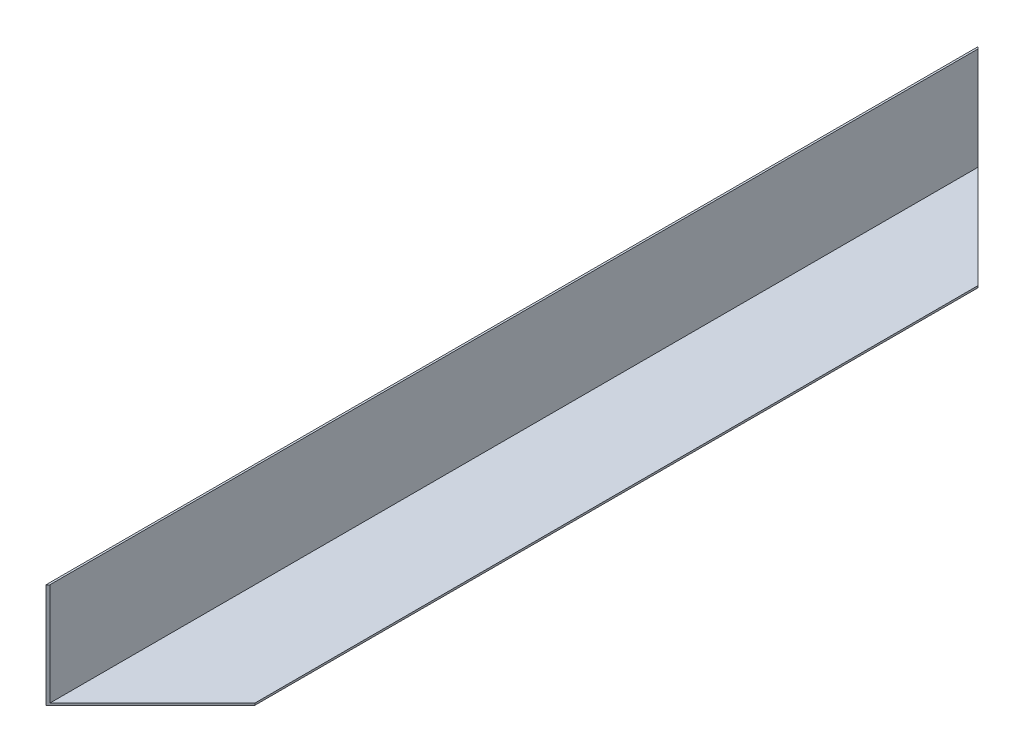
ISO-10303-21;
HEADER;
FILE_DESCRIPTION(('STEP AP214'),'2;1');
FILE_NAME('part.step','',(''),(''),'','','');
FILE_SCHEMA(('AUTOMOTIVE_DESIGN { 1 0 10303 214 1 1 1 1 }'));
ENDSEC;
DATA;
#1=APPLICATION_CONTEXT('core data for automotive mechanical design processes');
#2=APPLICATION_PROTOCOL_DEFINITION('international standard','automotive_design',2000,#1);
#3=PRODUCT_CONTEXT('',#1,'mechanical');
#4=PRODUCT('Part','Part','',(#3));
#5=PRODUCT_RELATED_PRODUCT_CATEGORY('part','',(#4));
#6=PRODUCT_DEFINITION_FORMATION('','',#4);
#7=PRODUCT_DEFINITION_CONTEXT('part definition',#1,'design');
#8=PRODUCT_DEFINITION('design','',#6,#7);
#9=PRODUCT_DEFINITION_SHAPE('','',#8);
#10=(LENGTH_UNIT() NAMED_UNIT(*) SI_UNIT(.MILLI.,.METRE.));
#11=(NAMED_UNIT(*) PLANE_ANGLE_UNIT() SI_UNIT($,.RADIAN.));
#12=(NAMED_UNIT(*) SI_UNIT($,.STERADIAN.) SOLID_ANGLE_UNIT());
#13=UNCERTAINTY_MEASURE_WITH_UNIT(LENGTH_MEASURE(1.E-05),#10,'distance_accuracy_value','');
#14=(GEOMETRIC_REPRESENTATION_CONTEXT(3) GLOBAL_UNCERTAINTY_ASSIGNED_CONTEXT((#13)) GLOBAL_UNIT_ASSIGNED_CONTEXT((#10,
#11,#12)) REPRESENTATION_CONTEXT('',''));
#15=CARTESIAN_POINT('',(0.,0.,0.));
#16=DIRECTION('',(0.,0.,1.));
#17=DIRECTION('',(1.,0.,0.));
#18=AXIS2_PLACEMENT_3D('',#15,#16,#17);
#19=CARTESIAN_POINT('',(0.833333333333333,45.,210.));
#20=DIRECTION('',(0.,-1.,0.));
#21=DIRECTION('',(0.,0.,-1.));
#22=AXIS2_PLACEMENT_3D('',#19,#20,#21);
#23=PLANE('',#22);
#24=DIRECTION('',(-0.707106781186549,0.,0.707106781186546));
#25=VECTOR('',#24,1.);
#26=CARTESIAN_POINT('',(-4.16666666666663,45.,205.));
#27=LINE('',#26,#25);
#28=CARTESIAN_POINT('',(0.833333333333333,45.,200.));
#29=VERTEX_POINT('',#28);
#30=CARTESIAN_POINT('',(0.,45.,200.833333333333));
#31=VERTEX_POINT('',#30);
#32=EDGE_CURVE('E101',#29,#31,#27,.T.);
#33=ORIENTED_EDGE('',*,*,#32,.F.);
#34=DIRECTION('',(0.,0.,-1.));
#35=VECTOR('',#34,1.);
#36=CARTESIAN_POINT('',(0.833333333333333,45.,210.));
#37=LINE('',#36,#35);
#38=CARTESIAN_POINT('',(0.833333333333333,45.,-200.));
#39=VERTEX_POINT('',#38);
#40=EDGE_CURVE('E89',#29,#39,#37,.T.);
#41=ORIENTED_EDGE('',*,*,#40,.T.);
#42=DIRECTION('',(-0.707106781186549,0.,-0.707106781186546));
#43=VECTOR('',#42,1.);
#44=CARTESIAN_POINT('',(205.833333333333,45.,4.99999999999931));
#45=LINE('',#44,#43);
#46=CARTESIAN_POINT('',(0.,45.,-200.833333333333));
#47=VERTEX_POINT('',#46);
#48=EDGE_CURVE('E98',#39,#47,#45,.T.);
#49=ORIENTED_EDGE('',*,*,#48,.T.);
#50=DIRECTION('',(0.,0.,-1.));
#51=VECTOR('',#50,1.);
#52=CARTESIAN_POINT('',(0.,45.,210.));
#53=LINE('',#52,#51);
#54=EDGE_CURVE('E102',#31,#47,#53,.T.);
#55=ORIENTED_EDGE('',*,*,#54,.F.);
#56=EDGE_LOOP('',(#33,#41,#49,#55));
#57=FACE_BOUND('',#56,.T.);
#58=ADVANCED_FACE('F37',(#57),#23,.F.);
#59=CARTESIAN_POINT('',(0.,45.,210.));
#60=DIRECTION('',(1.,0.,0.));
#61=DIRECTION('',(0.,0.,-1.));
#62=AXIS2_PLACEMENT_3D('',#59,#60,#61);
#63=PLANE('',#62);
#64=DIRECTION('',(0.,-1.,0.));
#65=VECTOR('',#64,1.);
#66=CARTESIAN_POINT('',(0.,45.,200.833333333333));
#67=LINE('',#66,#65);
#68=CARTESIAN_POINT('',(0.,0.,200.833333333333));
#69=VERTEX_POINT('',#68);
#70=EDGE_CURVE('E51',#31,#69,#67,.T.);
#71=ORIENTED_EDGE('',*,*,#70,.F.);
#72=ORIENTED_EDGE('',*,*,#54,.T.);
#73=DIRECTION('',(0.,-1.,0.));
#74=VECTOR('',#73,1.);
#75=CARTESIAN_POINT('',(0.,45.,-200.833333333333));
#76=LINE('',#75,#74);
#77=CARTESIAN_POINT('',(0.,0.,-200.833333333333));
#78=VERTEX_POINT('',#77);
#79=EDGE_CURVE('E126',#47,#78,#76,.T.);
#80=ORIENTED_EDGE('',*,*,#79,.T.);
#81=DIRECTION('',(0.,0.,-1.));
#82=VECTOR('',#81,1.);
#83=CARTESIAN_POINT('',(0.,0.,210.));
#84=LINE('',#83,#82);
#85=EDGE_CURVE('E135',#69,#78,#84,.T.);
#86=ORIENTED_EDGE('',*,*,#85,.F.);
#87=EDGE_LOOP('',(#71,#72,#80,#86));
#88=FACE_BOUND('',#87,.T.);
#89=ADVANCED_FACE('F138',(#88),#63,.F.);
#90=CARTESIAN_POINT('',(0.,0.,210.));
#91=DIRECTION('',(0.,1.,0.));
#92=DIRECTION('',(0.,0.,1.));
#93=AXIS2_PLACEMENT_3D('',#90,#91,#92);
#94=PLANE('',#93);
#95=DIRECTION('',(0.707106781186549,0.,-0.707106781186546));
#96=VECTOR('',#95,1.);
#97=CARTESIAN_POINT('',(-4.5833333333333,0.,205.416666666667));
#98=LINE('',#97,#96);
#99=CARTESIAN_POINT('',(45.,0.,155.833333333334));
#100=VERTEX_POINT('',#99);
#101=EDGE_CURVE('E59',#69,#100,#98,.T.);
#102=ORIENTED_EDGE('',*,*,#101,.F.);
#103=ORIENTED_EDGE('',*,*,#85,.T.);
#104=DIRECTION('',(0.707106781186549,0.,0.707106781186546));
#105=VECTOR('',#104,1.);
#106=CARTESIAN_POINT('',(205.416666666667,0.,4.58333333333266));
#107=LINE('',#106,#105);
#108=CARTESIAN_POINT('',(45.,0.,-155.833333333334));
#109=VERTEX_POINT('',#108);
#110=EDGE_CURVE('E123',#78,#109,#107,.T.);
#111=ORIENTED_EDGE('',*,*,#110,.T.);
#112=DIRECTION('',(0.,0.,-1.));
#113=VECTOR('',#112,1.);
#114=CARTESIAN_POINT('',(45.,0.,210.));
#115=LINE('',#114,#113);
#116=EDGE_CURVE('E133',#100,#109,#115,.T.);
#117=ORIENTED_EDGE('',*,*,#116,.F.);
#118=EDGE_LOOP('',(#102,#103,#111,#117));
#119=FACE_BOUND('',#118,.T.);
#120=ADVANCED_FACE('F144',(#119),#94,.F.);
#121=CARTESIAN_POINT('',(45.,0.,210.));
#122=DIRECTION('',(-1.,0.,0.));
#123=DIRECTION('',(0.,0.,1.));
#124=AXIS2_PLACEMENT_3D('',#121,#122,#123);
#125=PLANE('',#124);
#126=DIRECTION('',(0.,1.,0.));
#127=VECTOR('',#126,1.);
#128=CARTESIAN_POINT('',(45.,0.,155.833333333334));
#129=LINE('',#128,#127);
#130=CARTESIAN_POINT('',(45.,0.833333333333333,155.833333333334));
#131=VERTEX_POINT('',#130);
#132=EDGE_CURVE('E110',#100,#131,#129,.T.);
#133=ORIENTED_EDGE('',*,*,#132,.F.);
#134=ORIENTED_EDGE('',*,*,#116,.T.);
#135=DIRECTION('',(0.,1.,0.));
#136=VECTOR('',#135,1.);
#137=CARTESIAN_POINT('',(45.,0.,-155.833333333334));
#138=LINE('',#137,#136);
#139=CARTESIAN_POINT('',(45.,0.833333333333333,-155.833333333333));
#140=VERTEX_POINT('',#139);
#141=EDGE_CURVE('E120',#109,#140,#138,.T.);
#142=ORIENTED_EDGE('',*,*,#141,.T.);
#143=DIRECTION('',(0.,0.,-1.));
#144=VECTOR('',#143,1.);
#145=CARTESIAN_POINT('',(45.,0.833333333333333,210.));
#146=LINE('',#145,#144);
#147=EDGE_CURVE('E131',#131,#140,#146,.T.);
#148=ORIENTED_EDGE('',*,*,#147,.F.);
#149=EDGE_LOOP('',(#133,#134,#142,#148));
#150=FACE_BOUND('',#149,.T.);
#151=ADVANCED_FACE('F146',(#150),#125,.F.);
#152=CARTESIAN_POINT('',(45.,0.833333333333333,210.));
#153=DIRECTION('',(0.,-1.,0.));
#154=DIRECTION('',(1.,0.,0.));
#155=AXIS2_PLACEMENT_3D('',#152,#153,#154);
#156=PLANE('',#155);
#157=DIRECTION('',(-0.707106781186549,0.,0.707106781186546));
#158=VECTOR('',#157,1.);
#159=CARTESIAN_POINT('',(17.9166666666668,0.83333333333333,182.916666666667));
#160=LINE('',#159,#158);
#161=CARTESIAN_POINT('',(0.833333333333332,0.833333333333327,200.));
#162=VERTEX_POINT('',#161);
#163=EDGE_CURVE('E109',#131,#162,#160,.T.);
#164=ORIENTED_EDGE('',*,*,#163,.F.);
#165=ORIENTED_EDGE('',*,*,#147,.T.);
#166=DIRECTION('',(-0.707106781186549,0.,-0.707106781186546));
#167=VECTOR('',#166,1.);
#168=CARTESIAN_POINT('',(227.916666666667,0.833333333333359,27.0833333333327));
#169=LINE('',#168,#167);
#170=CARTESIAN_POINT('',(0.833333333333332,0.833333333333327,-200.));
#171=VERTEX_POINT('',#170);
#172=EDGE_CURVE('E104',#140,#171,#169,.T.);
#173=ORIENTED_EDGE('',*,*,#172,.T.);
#174=DIRECTION('',(0.,0.,-1.));
#175=VECTOR('',#174,1.);
#176=CARTESIAN_POINT('',(0.833333333333332,0.833333333333327,210.));
#177=LINE('',#176,#175);
#178=EDGE_CURVE('E97',#162,#171,#177,.T.);
#179=ORIENTED_EDGE('',*,*,#178,.F.);
#180=EDGE_LOOP('',(#164,#165,#173,#179));
#181=FACE_BOUND('',#180,.T.);
#182=ADVANCED_FACE('F147',(#181),#156,.F.);
#183=CARTESIAN_POINT('',(0.833333333333332,0.833333333333327,210.));
#184=DIRECTION('',(-1.,0.,0.));
#185=DIRECTION('',(0.,-1.,0.));
#186=AXIS2_PLACEMENT_3D('',#183,#184,#185);
#187=PLANE('',#186);
#188=DIRECTION('',(0.,1.,0.));
#189=VECTOR('',#188,1.);
#190=CARTESIAN_POINT('',(0.833333333333332,0.833333333333327,200.));
#191=LINE('',#190,#189);
#192=EDGE_CURVE('E12',#162,#29,#191,.T.);
#193=ORIENTED_EDGE('',*,*,#192,.F.);
#194=ORIENTED_EDGE('',*,*,#178,.T.);
#195=DIRECTION('',(0.,1.,0.));
#196=VECTOR('',#195,1.);
#197=CARTESIAN_POINT('',(0.833333333333332,0.833333333333344,-200.));
#198=LINE('',#197,#196);
#199=EDGE_CURVE('E44',#171,#39,#198,.T.);
#200=ORIENTED_EDGE('',*,*,#199,.T.);
#201=ORIENTED_EDGE('',*,*,#40,.F.);
#202=EDGE_LOOP('',(#193,#194,#200,#201));
#203=FACE_BOUND('',#202,.T.);
#204=ADVANCED_FACE('F91',(#203),#187,.F.);
#205=CARTESIAN_POINT('',(100.416666666667,0.,-100.416666666667));
#206=DIRECTION('',(-0.707106781186546,0.,0.707106781186549));
#207=DIRECTION('',(0.707106781186549,0.,0.707106781186546));
#208=AXIS2_PLACEMENT_3D('',#205,#206,#207);
#209=PLANE('',#208);
#210=ORIENTED_EDGE('',*,*,#48,.F.);
#211=ORIENTED_EDGE('',*,*,#199,.F.);
#212=ORIENTED_EDGE('',*,*,#172,.F.);
#213=ORIENTED_EDGE('',*,*,#141,.F.);
#214=ORIENTED_EDGE('',*,*,#110,.F.);
#215=ORIENTED_EDGE('',*,*,#79,.F.);
#216=EDGE_LOOP('',(#210,#211,#212,#213,#214,#215));
#217=FACE_BOUND('',#216,.T.);
#218=ADVANCED_FACE('F141',(#217),#209,.F.);
#219=CARTESIAN_POINT('',(100.416666666667,0.,100.416666666667));
#220=DIRECTION('',(0.707106781186546,0.,0.707106781186549));
#221=DIRECTION('',(0.707106781186549,0.,-0.707106781186546));
#222=AXIS2_PLACEMENT_3D('',#219,#220,#221);
#223=PLANE('',#222);
#224=ORIENTED_EDGE('',*,*,#192,.T.);
#225=ORIENTED_EDGE('',*,*,#32,.T.);
#226=ORIENTED_EDGE('',*,*,#70,.T.);
#227=ORIENTED_EDGE('',*,*,#101,.T.);
#228=ORIENTED_EDGE('',*,*,#132,.T.);
#229=ORIENTED_EDGE('',*,*,#163,.T.);
#230=EDGE_LOOP('',(#224,#225,#226,#227,#228,#229));
#231=FACE_BOUND('',#230,.T.);
#232=ADVANCED_FACE('F107',(#231),#223,.T.);
#233=CLOSED_SHELL('',(#58,#89,#120,#151,#182,#204,#218,#232));
#234=MANIFOLD_SOLID_BREP('B2',#233);
#235=ADVANCED_BREP_SHAPE_REPRESENTATION('',(#18,#234),#14);
#236=SHAPE_DEFINITION_REPRESENTATION(#9,#235);
ENDSEC;
END-ISO-10303-21;
